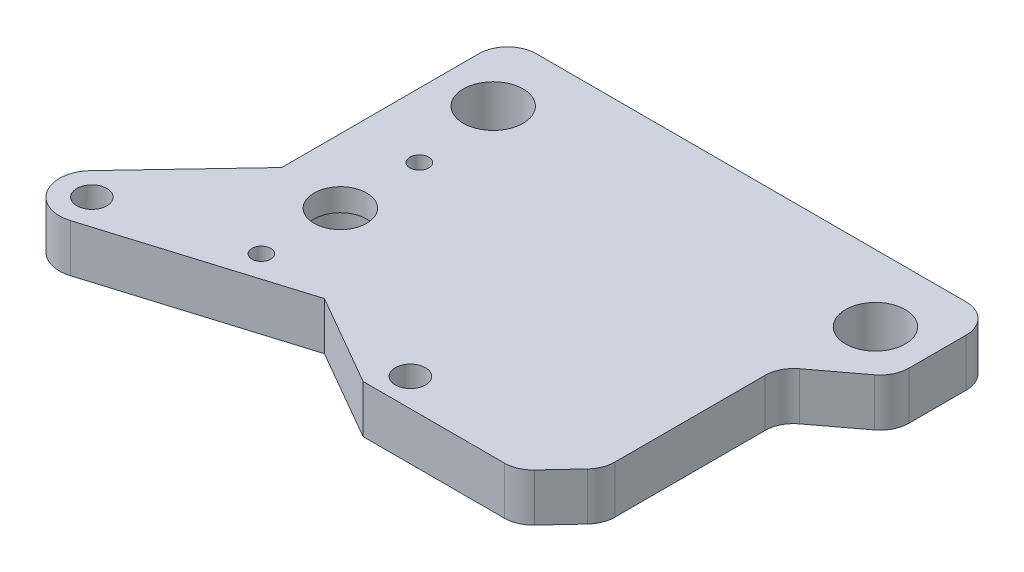
ISO-10303-21;
HEADER;
FILE_DESCRIPTION(('STEP AP214'),'2;1');
FILE_NAME('part.step','',(''),(''),'','','');
FILE_SCHEMA(('AUTOMOTIVE_DESIGN { 1 0 10303 214 1 1 1 1 }'));
ENDSEC;
DATA;
#1=APPLICATION_CONTEXT('core data for automotive mechanical design processes');
#2=APPLICATION_PROTOCOL_DEFINITION('international standard','automotive_design',2000,#1);
#3=PRODUCT_CONTEXT('',#1,'mechanical');
#4=PRODUCT('Part','Part','',(#3));
#5=PRODUCT_RELATED_PRODUCT_CATEGORY('part','',(#4));
#6=PRODUCT_DEFINITION_FORMATION('','',#4);
#7=PRODUCT_DEFINITION_CONTEXT('part definition',#1,'design');
#8=PRODUCT_DEFINITION('design','',#6,#7);
#9=PRODUCT_DEFINITION_SHAPE('','',#8);
#10=(LENGTH_UNIT() NAMED_UNIT(*) SI_UNIT(.MILLI.,.METRE.));
#11=(NAMED_UNIT(*) PLANE_ANGLE_UNIT() SI_UNIT($,.RADIAN.));
#12=(NAMED_UNIT(*) SI_UNIT($,.STERADIAN.) SOLID_ANGLE_UNIT());
#13=UNCERTAINTY_MEASURE_WITH_UNIT(LENGTH_MEASURE(1.E-05),#10,'distance_accuracy_value','');
#14=(GEOMETRIC_REPRESENTATION_CONTEXT(3) GLOBAL_UNCERTAINTY_ASSIGNED_CONTEXT((#13)) GLOBAL_UNIT_ASSIGNED_CONTEXT((#10,
#11,#12)) REPRESENTATION_CONTEXT('',''));
#15=CARTESIAN_POINT('',(0.,0.,0.));
#16=DIRECTION('',(0.,0.,1.));
#17=DIRECTION('',(1.,0.,0.));
#18=AXIS2_PLACEMENT_3D('',#15,#16,#17);
#19=CARTESIAN_POINT('',(0.,-6.35,0.));
#20=DIRECTION('',(0.,1.,0.));
#21=DIRECTION('',(0.,0.,1.));
#22=AXIS2_PLACEMENT_3D('',#19,#20,#21);
#23=CYLINDRICAL_SURFACE('',#22,5.);
#24=CARTESIAN_POINT('',(0.,-6.35,0.));
#25=DIRECTION('',(0.,1.,0.));
#26=DIRECTION('',(0.,0.,1.));
#27=AXIS2_PLACEMENT_3D('',#24,#25,#26);
#28=CIRCLE('',#27,5.);
#29=CARTESIAN_POINT('',(0.,-6.35,5.));
#30=VERTEX_POINT('',#29);
#31=EDGE_CURVE('E222',#30,#30,#28,.T.);
#32=ORIENTED_EDGE('',*,*,#31,.F.);
#33=EDGE_LOOP('',(#32));
#34=FACE_BOUND('',#33,.T.);
#35=CARTESIAN_POINT('',(0.,-3.,0.));
#36=DIRECTION('',(0.,1.,0.));
#37=DIRECTION('',(0.,0.,1.));
#38=AXIS2_PLACEMENT_3D('',#35,#36,#37);
#39=CIRCLE('',#38,5.);
#40=CARTESIAN_POINT('',(0.,-3.,5.));
#41=VERTEX_POINT('',#40);
#42=EDGE_CURVE('E11',#41,#41,#39,.F.);
#43=ORIENTED_EDGE('',*,*,#42,.F.);
#44=EDGE_LOOP('',(#43));
#45=FACE_BOUND('',#44,.T.);
#46=ADVANCED_FACE('F43',(#34,#45),#23,.F.);
#47=CARTESIAN_POINT('',(-17.78,-6.35,15.24));
#48=DIRECTION('',(0.,1.,0.));
#49=DIRECTION('',(0.,0.,1.));
#50=AXIS2_PLACEMENT_3D('',#47,#48,#49);
#51=CYLINDRICAL_SURFACE('',#50,4.318);
#52=CARTESIAN_POINT('',(-17.78,0.,15.24));
#53=DIRECTION('',(0.,1.,0.));
#54=DIRECTION('',(0.,0.,1.));
#55=AXIS2_PLACEMENT_3D('',#52,#53,#54);
#56=CIRCLE('',#55,4.318);
#57=CARTESIAN_POINT('',(-16.5178103251182,0.,19.3694068853313));
#58=VERTEX_POINT('',#57);
#59=CARTESIAN_POINT('',(-20.9174164667158,0.,12.2732270200805));
#60=VERTEX_POINT('',#59);
#61=EDGE_CURVE('E227',#58,#60,#56,.F.);
#62=ORIENTED_EDGE('',*,*,#61,.T.);
#63=DIRECTION('',(0.,1.,0.));
#64=VECTOR('',#63,1.);
#65=CARTESIAN_POINT('',(-20.9174164667158,-6.35,12.2732270200805));
#66=LINE('',#65,#64);
#67=CARTESIAN_POINT('',(-20.9174164667158,-6.35,12.2732270200805));
#68=VERTEX_POINT('',#67);
#69=EDGE_CURVE('E53',#68,#60,#66,.T.);
#70=ORIENTED_EDGE('',*,*,#69,.F.);
#71=CARTESIAN_POINT('',(-17.78,-6.35,15.24));
#72=DIRECTION('',(0.,1.,0.));
#73=DIRECTION('',(0.,0.,1.));
#74=AXIS2_PLACEMENT_3D('',#71,#72,#73);
#75=CIRCLE('',#74,4.318);
#76=CARTESIAN_POINT('',(-16.5178103251182,-6.35,19.3694068853313));
#77=VERTEX_POINT('',#76);
#78=EDGE_CURVE('E61',#77,#68,#75,.F.);
#79=ORIENTED_EDGE('',*,*,#78,.F.);
#80=DIRECTION('',(0.,1.,0.));
#81=VECTOR('',#80,1.);
#82=CARTESIAN_POINT('',(-16.5178103251182,-6.35,19.3694068853313));
#83=LINE('',#82,#81);
#84=EDGE_CURVE('E226',#77,#58,#83,.T.);
#85=ORIENTED_EDGE('',*,*,#84,.T.);
#86=EDGE_LOOP('',(#62,#70,#79,#85));
#87=FACE_BOUND('',#86,.T.);
#88=ADVANCED_FACE('F45',(#87),#51,.T.);
#89=CARTESIAN_POINT('',(-4.91597138022378,-6.35,-4.64859262888105));
#90=DIRECTION('',(-0.726590196089821,0.,-0.687071093080007));
#91=DIRECTION('',(-0.687071093080007,0.,0.726590196089821));
#92=AXIS2_PLACEMENT_3D('',#89,#90,#91);
#93=PLANE('',#92);
#94=DIRECTION('',(-0.687071093080007,0.,0.726590196089821));
#95=VECTOR('',#94,1.);
#96=CARTESIAN_POINT('',(-4.91597138022378,0.,-4.64859262888105));
#97=LINE('',#96,#95);
#98=CARTESIAN_POINT('',(-8.5725,0.,-0.781747008959347));
#99=VERTEX_POINT('',#98);
#100=EDGE_CURVE('E281',#99,#60,#97,.T.);
#101=ORIENTED_EDGE('',*,*,#100,.F.);
#102=DIRECTION('',(0.,1.,0.));
#103=VECTOR('',#102,1.);
#104=CARTESIAN_POINT('',(-8.5725,-6.35,-0.781747008959347));
#105=LINE('',#104,#103);
#106=CARTESIAN_POINT('',(-8.5725,-6.35,-0.781747008959347));
#107=VERTEX_POINT('',#106);
#108=EDGE_CURVE('E117',#107,#99,#105,.T.);
#109=ORIENTED_EDGE('',*,*,#108,.F.);
#110=DIRECTION('',(-0.687071093080007,0.,0.726590196089821));
#111=VECTOR('',#110,1.);
#112=CARTESIAN_POINT('',(-4.91597138022378,-6.35,-4.64859262888105));
#113=LINE('',#112,#111);
#114=EDGE_CURVE('E191',#107,#68,#113,.T.);
#115=ORIENTED_EDGE('',*,*,#114,.T.);
#116=ORIENTED_EDGE('',*,*,#69,.T.);
#117=EDGE_LOOP('',(#101,#109,#115,#116));
#118=FACE_BOUND('',#117,.T.);
#119=ADVANCED_FACE('F366',(#118),#93,.T.);
#120=CARTESIAN_POINT('',(-8.5725,-6.35,0.));
#121=DIRECTION('',(-1.,0.,0.));
#122=DIRECTION('',(0.,0.,1.));
#123=AXIS2_PLACEMENT_3D('',#120,#121,#122);
#124=PLANE('',#123);
#125=DIRECTION('',(0.,0.,1.));
#126=VECTOR('',#125,1.);
#127=CARTESIAN_POINT('',(-8.5725,0.,0.));
#128=LINE('',#127,#126);
#129=CARTESIAN_POINT('',(-8.5725,0.,-26.9875));
#130=VERTEX_POINT('',#129);
#131=EDGE_CURVE('E174',#130,#99,#128,.T.);
#132=ORIENTED_EDGE('',*,*,#131,.F.);
#133=DIRECTION('',(0.,1.,0.));
#134=VECTOR('',#133,1.);
#135=CARTESIAN_POINT('',(-8.5725,-6.35,-26.9875));
#136=LINE('',#135,#134);
#137=CARTESIAN_POINT('',(-8.5725,-6.35,-26.9875));
#138=VERTEX_POINT('',#137);
#139=EDGE_CURVE('E169',#138,#130,#136,.T.);
#140=ORIENTED_EDGE('',*,*,#139,.F.);
#141=DIRECTION('',(0.,0.,1.));
#142=VECTOR('',#141,1.);
#143=CARTESIAN_POINT('',(-8.5725,-6.35,0.));
#144=LINE('',#143,#142);
#145=EDGE_CURVE('E173',#138,#107,#144,.T.);
#146=ORIENTED_EDGE('',*,*,#145,.T.);
#147=ORIENTED_EDGE('',*,*,#108,.T.);
#148=EDGE_LOOP('',(#132,#140,#146,#147));
#149=FACE_BOUND('',#148,.T.);
#150=ADVANCED_FACE('F171',(#149),#124,.T.);
#151=CARTESIAN_POINT('',(-4.7625,-6.35,-26.9875));
#152=DIRECTION('',(0.,1.,0.));
#153=DIRECTION('',(0.,0.,1.));
#154=AXIS2_PLACEMENT_3D('',#151,#152,#153);
#155=CYLINDRICAL_SURFACE('',#154,3.81);
#156=CARTESIAN_POINT('',(-4.7625,0.,-26.9875));
#157=DIRECTION('',(0.,1.,0.));
#158=DIRECTION('',(0.,0.,1.));
#159=AXIS2_PLACEMENT_3D('',#156,#157,#158);
#160=CIRCLE('',#159,3.81);
#161=CARTESIAN_POINT('',(-4.7625,0.,-30.7975));
#162=VERTEX_POINT('',#161);
#163=EDGE_CURVE('E276',#130,#162,#160,.F.);
#164=ORIENTED_EDGE('',*,*,#163,.T.);
#165=DIRECTION('',(0.,1.,0.));
#166=VECTOR('',#165,1.);
#167=CARTESIAN_POINT('',(-4.7625,-6.35,-30.7975));
#168=LINE('',#167,#166);
#169=CARTESIAN_POINT('',(-4.7625,-6.35,-30.7975));
#170=VERTEX_POINT('',#169);
#171=EDGE_CURVE('E179',#170,#162,#168,.T.);
#172=ORIENTED_EDGE('',*,*,#171,.F.);
#173=CARTESIAN_POINT('',(-4.7625,-6.35,-26.9875));
#174=DIRECTION('',(0.,1.,0.));
#175=DIRECTION('',(0.,0.,1.));
#176=AXIS2_PLACEMENT_3D('',#173,#174,#175);
#177=CIRCLE('',#176,3.81);
#178=EDGE_CURVE('E182',#138,#170,#177,.F.);
#179=ORIENTED_EDGE('',*,*,#178,.F.);
#180=ORIENTED_EDGE('',*,*,#139,.T.);
#181=EDGE_LOOP('',(#164,#172,#179,#180));
#182=FACE_BOUND('',#181,.T.);
#183=ADVANCED_FACE('F183',(#182),#155,.T.);
#184=CARTESIAN_POINT('',(0.,-6.35,-30.7975));
#185=DIRECTION('',(0.,0.,-1.));
#186=DIRECTION('',(-1.,0.,0.));
#187=AXIS2_PLACEMENT_3D('',#184,#185,#186);
#188=PLANE('',#187);
#189=DIRECTION('',(-1.,0.,0.));
#190=VECTOR('',#189,1.);
#191=CARTESIAN_POINT('',(0.,0.,-30.7975));
#192=LINE('',#191,#190);
#193=CARTESIAN_POINT('',(52.3875,0.,-30.7975));
#194=VERTEX_POINT('',#193);
#195=EDGE_CURVE('E272',#194,#162,#192,.T.);
#196=ORIENTED_EDGE('',*,*,#195,.F.);
#197=DIRECTION('',(0.,1.,0.));
#198=VECTOR('',#197,1.);
#199=CARTESIAN_POINT('',(52.3875,-6.35,-30.7975));
#200=LINE('',#199,#198);
#201=CARTESIAN_POINT('',(52.3875,-6.35,-30.7975));
#202=VERTEX_POINT('',#201);
#203=EDGE_CURVE('E315',#202,#194,#200,.T.);
#204=ORIENTED_EDGE('',*,*,#203,.F.);
#205=DIRECTION('',(-1.,0.,0.));
#206=VECTOR('',#205,1.);
#207=CARTESIAN_POINT('',(0.,-6.35,-30.7975));
#208=LINE('',#207,#206);
#209=EDGE_CURVE('E187',#202,#170,#208,.T.);
#210=ORIENTED_EDGE('',*,*,#209,.T.);
#211=ORIENTED_EDGE('',*,*,#171,.T.);
#212=EDGE_LOOP('',(#196,#204,#210,#211));
#213=FACE_BOUND('',#212,.T.);
#214=ADVANCED_FACE('F480',(#213),#188,.T.);
#215=CARTESIAN_POINT('',(52.3875,-6.35,-26.9875));
#216=DIRECTION('',(0.,1.,0.));
#217=DIRECTION('',(0.,0.,1.));
#218=AXIS2_PLACEMENT_3D('',#215,#216,#217);
#219=CYLINDRICAL_SURFACE('',#218,3.81);
#220=CARTESIAN_POINT('',(52.3875,0.,-26.9875));
#221=DIRECTION('',(0.,1.,0.));
#222=DIRECTION('',(0.,0.,1.));
#223=AXIS2_PLACEMENT_3D('',#220,#221,#222);
#224=CIRCLE('',#223,3.81);
#225=CARTESIAN_POINT('',(56.1975,0.,-26.9875));
#226=VERTEX_POINT('',#225);
#227=EDGE_CURVE('E268',#194,#226,#224,.F.);
#228=ORIENTED_EDGE('',*,*,#227,.T.);
#229=DIRECTION('',(0.,1.,0.));
#230=VECTOR('',#229,1.);
#231=CARTESIAN_POINT('',(56.1975,-6.35,-26.9875));
#232=LINE('',#231,#230);
#233=CARTESIAN_POINT('',(56.1975,-6.35,-26.9875));
#234=VERTEX_POINT('',#233);
#235=EDGE_CURVE('E318',#234,#226,#232,.T.);
#236=ORIENTED_EDGE('',*,*,#235,.F.);
#237=CARTESIAN_POINT('',(52.3875,-6.35,-26.9875));
#238=DIRECTION('',(0.,1.,0.));
#239=DIRECTION('',(0.,0.,1.));
#240=AXIS2_PLACEMENT_3D('',#237,#238,#239);
#241=CIRCLE('',#240,3.81);
#242=EDGE_CURVE('E475',#202,#234,#241,.F.);
#243=ORIENTED_EDGE('',*,*,#242,.F.);
#244=ORIENTED_EDGE('',*,*,#203,.T.);
#245=EDGE_LOOP('',(#228,#236,#243,#244));
#246=FACE_BOUND('',#245,.T.);
#247=ADVANCED_FACE('F485',(#246),#219,.T.);
#248=CARTESIAN_POINT('',(56.1975,-6.35,1.02276151248003E-13));
#249=DIRECTION('',(1.,0.,0.));
#250=DIRECTION('',(0.,0.,-1.));
#251=AXIS2_PLACEMENT_3D('',#248,#249,#250);
#252=PLANE('',#251);
#253=DIRECTION('',(0.,0.,-1.));
#254=VECTOR('',#253,1.);
#255=CARTESIAN_POINT('',(56.1975,0.,1.02276151248003E-13));
#256=LINE('',#255,#254);
#257=CARTESIAN_POINT('',(56.1975,0.,-19.3620959266836));
#258=VERTEX_POINT('',#257);
#259=EDGE_CURVE('E264',#258,#226,#256,.T.);
#260=ORIENTED_EDGE('',*,*,#259,.F.);
#261=DIRECTION('',(0.,1.,0.));
#262=VECTOR('',#261,1.);
#263=CARTESIAN_POINT('',(56.1975,-6.35,-19.3620959266836));
#264=LINE('',#263,#262);
#265=CARTESIAN_POINT('',(56.1975,-6.35,-19.3620959266836));
#266=VERTEX_POINT('',#265);
#267=EDGE_CURVE('E321',#266,#258,#264,.T.);
#268=ORIENTED_EDGE('',*,*,#267,.F.);
#269=DIRECTION('',(0.,0.,-1.));
#270=VECTOR('',#269,1.);
#271=CARTESIAN_POINT('',(56.1975,-6.35,1.02276151248003E-13));
#272=LINE('',#271,#270);
#273=EDGE_CURVE('E471',#266,#234,#272,.T.);
#274=ORIENTED_EDGE('',*,*,#273,.T.);
#275=ORIENTED_EDGE('',*,*,#235,.T.);
#276=EDGE_LOOP('',(#260,#268,#274,#275));
#277=FACE_BOUND('',#276,.T.);
#278=ADVANCED_FACE('F489',(#277),#252,.T.);
#279=CARTESIAN_POINT('',(52.3875,-6.35,-19.3620959266836));
#280=DIRECTION('',(0.,1.,0.));
#281=DIRECTION('',(0.,0.,1.));
#282=AXIS2_PLACEMENT_3D('',#279,#280,#281);
#283=CYLINDRICAL_SURFACE('',#282,3.81);
#284=CARTESIAN_POINT('',(52.3875,0.,-19.3620959266836));
#285=DIRECTION('',(0.,1.,0.));
#286=DIRECTION('',(0.,0.,1.));
#287=AXIS2_PLACEMENT_3D('',#284,#285,#286);
#288=CIRCLE('',#287,3.81);
#289=CARTESIAN_POINT('',(54.6804152382093,0.,-16.3192946334034));
#290=VERTEX_POINT('',#289);
#291=EDGE_CURVE('E260',#258,#290,#288,.F.);
#292=ORIENTED_EDGE('',*,*,#291,.T.);
#293=DIRECTION('',(0.,1.,0.));
#294=VECTOR('',#293,1.);
#295=CARTESIAN_POINT('',(54.6804152382093,-6.35,-16.3192946334034));
#296=LINE('',#295,#294);
#297=CARTESIAN_POINT('',(54.6804152382093,-6.35,-16.3192946334034));
#298=VERTEX_POINT('',#297);
#299=EDGE_CURVE('E324',#298,#290,#296,.T.);
#300=ORIENTED_EDGE('',*,*,#299,.F.);
#301=CARTESIAN_POINT('',(52.3875,-6.35,-19.3620959266836));
#302=DIRECTION('',(0.,1.,0.));
#303=DIRECTION('',(0.,0.,1.));
#304=AXIS2_PLACEMENT_3D('',#301,#302,#303);
#305=CIRCLE('',#304,3.81);
#306=EDGE_CURVE('E468',#266,#298,#305,.F.);
#307=ORIENTED_EDGE('',*,*,#306,.F.);
#308=ORIENTED_EDGE('',*,*,#267,.T.);
#309=EDGE_LOOP('',(#292,#300,#307,#308));
#310=FACE_BOUND('',#309,.T.);
#311=ADVANCED_FACE('F494',(#310),#283,.T.);
#312=CARTESIAN_POINT('',(11.9606686655756,-6.35,15.8723434157696));
#313=DIRECTION('',(0.601815023152047,0.,0.798635510047294));
#314=DIRECTION('',(0.798635510047294,0.,-0.601815023152047));
#315=AXIS2_PLACEMENT_3D('',#312,#313,#314);
#316=PLANE('',#315);
#317=DIRECTION('',(0.798635510047294,0.,-0.601815023152047));
#318=VECTOR('',#317,1.);
#319=CARTESIAN_POINT('',(11.9606686655756,0.,15.8723434157696));
#320=LINE('',#319,#318);
#321=CARTESIAN_POINT('',(48.9855664772033,0.,-12.0279182848244));
#322=VERTEX_POINT('',#321);
#323=EDGE_CURVE('E256',#322,#290,#320,.T.);
#324=ORIENTED_EDGE('',*,*,#323,.F.);
#325=DIRECTION('',(0.,1.,0.));
#326=VECTOR('',#325,1.);
#327=CARTESIAN_POINT('',(48.9855664772033,-6.35,-12.0279182848244));
#328=LINE('',#327,#326);
#329=CARTESIAN_POINT('',(48.9855664772033,-6.35,-12.0279182848244));
#330=VERTEX_POINT('',#329);
#331=EDGE_CURVE('E327',#330,#322,#328,.T.);
#332=ORIENTED_EDGE('',*,*,#331,.F.);
#333=DIRECTION('',(0.798635510047294,0.,-0.601815023152047));
#334=VECTOR('',#333,1.);
#335=CARTESIAN_POINT('',(11.9606686655756,-6.35,15.8723434157696));
#336=LINE('',#335,#334);
#337=EDGE_CURVE('E464',#330,#298,#336,.T.);
#338=ORIENTED_EDGE('',*,*,#337,.T.);
#339=ORIENTED_EDGE('',*,*,#299,.T.);
#340=EDGE_LOOP('',(#324,#332,#338,#339));
#341=FACE_BOUND('',#340,.T.);
#342=ADVANCED_FACE('F530',(#341),#316,.T.);
#343=CARTESIAN_POINT('',(51.2784817154126,-6.35,-8.98511699154425));
#344=DIRECTION('',(0.,1.,0.));
#345=DIRECTION('',(0.,0.,1.));
#346=AXIS2_PLACEMENT_3D('',#343,#344,#345);
#347=CYLINDRICAL_SURFACE('',#346,3.80999999999999);
#348=CARTESIAN_POINT('',(51.2784817154126,0.,-8.98511699154425));
#349=DIRECTION('',(0.,1.,0.));
#350=DIRECTION('',(0.,0.,1.));
#351=AXIS2_PLACEMENT_3D('',#348,#349,#350);
#352=CIRCLE('',#351,3.80999999999999);
#353=CARTESIAN_POINT('',(47.4684817154126,0.,-8.98511699154425));
#354=VERTEX_POINT('',#353);
#355=EDGE_CURVE('E252',#354,#322,#352,.F.);
#356=ORIENTED_EDGE('',*,*,#355,.F.);
#357=DIRECTION('',(0.,1.,0.));
#358=VECTOR('',#357,1.);
#359=CARTESIAN_POINT('',(47.4684817154126,-6.35,-8.98511699154425));
#360=LINE('',#359,#358);
#361=CARTESIAN_POINT('',(47.4684817154126,-6.35,-8.98511699154425));
#362=VERTEX_POINT('',#361);
#363=EDGE_CURVE('E330',#362,#354,#360,.T.);
#364=ORIENTED_EDGE('',*,*,#363,.F.);
#365=CARTESIAN_POINT('',(51.2784817154126,-6.35,-8.98511699154425));
#366=DIRECTION('',(0.,1.,0.));
#367=DIRECTION('',(0.,0.,1.));
#368=AXIS2_PLACEMENT_3D('',#365,#366,#367);
#369=CIRCLE('',#368,3.80999999999999);
#370=EDGE_CURVE('E460',#362,#330,#369,.F.);
#371=ORIENTED_EDGE('',*,*,#370,.T.);
#372=ORIENTED_EDGE('',*,*,#331,.T.);
#373=EDGE_LOOP('',(#356,#364,#371,#372));
#374=FACE_BOUND('',#373,.T.);
#375=ADVANCED_FACE('F500',(#374),#347,.F.);
#376=CARTESIAN_POINT('',(47.4684817154126,-6.35,0.));
#377=DIRECTION('',(-1.,0.,0.));
#378=DIRECTION('',(0.,0.,1.));
#379=AXIS2_PLACEMENT_3D('',#376,#377,#378);
#380=PLANE('',#379);
#381=DIRECTION('',(0.,0.,1.));
#382=VECTOR('',#381,1.);
#383=CARTESIAN_POINT('',(47.4684817154126,0.,0.));
#384=LINE('',#383,#382);
#385=CARTESIAN_POINT('',(47.4684817154126,0.,10.9806107725939));
#386=VERTEX_POINT('',#385);
#387=EDGE_CURVE('E249',#354,#386,#384,.T.);
#388=ORIENTED_EDGE('',*,*,#387,.T.);
#389=DIRECTION('',(0.,1.,0.));
#390=VECTOR('',#389,1.);
#391=CARTESIAN_POINT('',(47.4684817154126,-6.35,10.9806107725939));
#392=LINE('',#391,#390);
#393=CARTESIAN_POINT('',(47.4684817154126,-6.35,10.9806107725939));
#394=VERTEX_POINT('',#393);
#395=EDGE_CURVE('E333',#394,#386,#392,.T.);
#396=ORIENTED_EDGE('',*,*,#395,.F.);
#397=DIRECTION('',(0.,0.,1.));
#398=VECTOR('',#397,1.);
#399=CARTESIAN_POINT('',(47.4684817154126,-6.35,0.));
#400=LINE('',#399,#398);
#401=EDGE_CURVE('E457',#362,#394,#400,.T.);
#402=ORIENTED_EDGE('',*,*,#401,.F.);
#403=ORIENTED_EDGE('',*,*,#363,.T.);
#404=EDGE_LOOP('',(#388,#396,#402,#403));
#405=FACE_BOUND('',#404,.T.);
#406=ADVANCED_FACE('F506',(#405),#380,.F.);
#407=CARTESIAN_POINT('',(43.6584817154126,-6.35,10.9806107725939));
#408=DIRECTION('',(0.,1.,0.));
#409=DIRECTION('',(0.,0.,1.));
#410=AXIS2_PLACEMENT_3D('',#407,#408,#409);
#411=CYLINDRICAL_SURFACE('',#410,3.81);
#412=CARTESIAN_POINT('',(43.6584817154126,0.,10.9806107725939));
#413=DIRECTION('',(0.,1.,0.));
#414=DIRECTION('',(0.,0.,1.));
#415=AXIS2_PLACEMENT_3D('',#412,#413,#414);
#416=CIRCLE('',#415,3.81);
#417=CARTESIAN_POINT('',(46.4449393185816,0.,13.579024524432));
#418=VERTEX_POINT('',#417);
#419=EDGE_CURVE('E246',#386,#418,#416,.F.);
#420=ORIENTED_EDGE('',*,*,#419,.T.);
#421=DIRECTION('',(0.,1.,0.));
#422=VECTOR('',#421,1.);
#423=CARTESIAN_POINT('',(46.4449393185816,-6.35,13.579024524432));
#424=LINE('',#423,#422);
#425=CARTESIAN_POINT('',(46.4449393185816,-6.35,13.579024524432));
#426=VERTEX_POINT('',#425);
#427=EDGE_CURVE('E337',#426,#418,#424,.T.);
#428=ORIENTED_EDGE('',*,*,#427,.F.);
#429=CARTESIAN_POINT('',(43.6584817154126,-6.35,10.9806107725939));
#430=DIRECTION('',(0.,1.,0.));
#431=DIRECTION('',(0.,0.,1.));
#432=AXIS2_PLACEMENT_3D('',#429,#430,#431);
#433=CIRCLE('',#432,3.81);
#434=EDGE_CURVE('E454',#394,#426,#433,.F.);
#435=ORIENTED_EDGE('',*,*,#434,.F.);
#436=ORIENTED_EDGE('',*,*,#395,.T.);
#437=EDGE_LOOP('',(#420,#428,#435,#436));
#438=FACE_BOUND('',#437,.T.);
#439=ADVANCED_FACE('F512',(#438),#411,.T.);
#440=CARTESIAN_POINT('',(31.6153606059378,-6.35,29.4818007187193));
#441=DIRECTION('',(-0.73135370161917,0.,-0.681998360062499));
#442=DIRECTION('',(-0.681998360062499,0.,0.73135370161917));
#443=AXIS2_PLACEMENT_3D('',#440,#441,#442);
#444=PLANE('',#443);
#445=DIRECTION('',(-0.681998360062499,0.,0.73135370161917));
#446=VECTOR('',#445,1.);
#447=CARTESIAN_POINT('',(31.6153606059378,0.,29.4818007187193));
#448=LINE('',#447,#446);
#449=CARTESIAN_POINT('',(43.0441600965525,0.,17.2259137518381));
#450=VERTEX_POINT('',#449);
#451=EDGE_CURVE('E243',#418,#450,#448,.T.);
#452=ORIENTED_EDGE('',*,*,#451,.T.);
#453=DIRECTION('',(0.,1.,0.));
#454=VECTOR('',#453,1.);
#455=CARTESIAN_POINT('',(43.0441600965525,-6.35,17.2259137518381));
#456=LINE('',#455,#454);
#457=CARTESIAN_POINT('',(43.0441600965525,-6.35,17.2259137518381));
#458=VERTEX_POINT('',#457);
#459=EDGE_CURVE('E341',#458,#450,#456,.T.);
#460=ORIENTED_EDGE('',*,*,#459,.F.);
#461=DIRECTION('',(-0.681998360062499,0.,0.73135370161917));
#462=VECTOR('',#461,1.);
#463=CARTESIAN_POINT('',(31.6153606059378,-6.35,29.4818007187193));
#464=LINE('',#463,#462);
#465=EDGE_CURVE('E451',#426,#458,#464,.T.);
#466=ORIENTED_EDGE('',*,*,#465,.F.);
#467=ORIENTED_EDGE('',*,*,#427,.T.);
#468=EDGE_LOOP('',(#452,#460,#466,#467));
#469=FACE_BOUND('',#468,.T.);
#470=ADVANCED_FACE('F516',(#469),#444,.F.);
#471=CARTESIAN_POINT('',(40.2577024933834,-6.35,14.6275));
#472=DIRECTION('',(0.,1.,0.));
#473=DIRECTION('',(0.,0.,1.));
#474=AXIS2_PLACEMENT_3D('',#471,#472,#473);
#475=CYLINDRICAL_SURFACE('',#474,3.81);
#476=CARTESIAN_POINT('',(40.2577024933834,0.,14.6275));
#477=DIRECTION('',(0.,1.,0.));
#478=DIRECTION('',(0.,0.,1.));
#479=AXIS2_PLACEMENT_3D('',#476,#477,#478);
#480=CIRCLE('',#479,3.81);
#481=CARTESIAN_POINT('',(40.2577024933834,0.,18.4375));
#482=VERTEX_POINT('',#481);
#483=EDGE_CURVE('E240',#450,#482,#480,.F.);
#484=ORIENTED_EDGE('',*,*,#483,.T.);
#485=DIRECTION('',(0.,1.,0.));
#486=VECTOR('',#485,1.);
#487=CARTESIAN_POINT('',(40.2577024933834,-6.35,18.4375));
#488=LINE('',#487,#486);
#489=CARTESIAN_POINT('',(40.2577024933834,-6.35,18.4375));
#490=VERTEX_POINT('',#489);
#491=EDGE_CURVE('E345',#490,#482,#488,.T.);
#492=ORIENTED_EDGE('',*,*,#491,.F.);
#493=CARTESIAN_POINT('',(40.2577024933834,-6.35,14.6275));
#494=DIRECTION('',(0.,1.,0.));
#495=DIRECTION('',(0.,0.,1.));
#496=AXIS2_PLACEMENT_3D('',#493,#494,#495);
#497=CIRCLE('',#496,3.81);
#498=EDGE_CURVE('E448',#458,#490,#497,.F.);
#499=ORIENTED_EDGE('',*,*,#498,.F.);
#500=ORIENTED_EDGE('',*,*,#459,.T.);
#501=EDGE_LOOP('',(#484,#492,#499,#500));
#502=FACE_BOUND('',#501,.T.);
#503=ADVANCED_FACE('F521',(#502),#475,.T.);
#504=CARTESIAN_POINT('',(0.,-6.35,18.4375));
#505=DIRECTION('',(0.,0.,-1.));
#506=DIRECTION('',(-1.,0.,0.));
#507=AXIS2_PLACEMENT_3D('',#504,#505,#506);
#508=PLANE('',#507);
#509=DIRECTION('',(-1.,0.,0.));
#510=VECTOR('',#509,1.);
#511=CARTESIAN_POINT('',(0.,0.,18.4375));
#512=LINE('',#511,#510);
#513=CARTESIAN_POINT('',(21.4659698195551,0.,18.4375));
#514=VERTEX_POINT('',#513);
#515=EDGE_CURVE('E237',#482,#514,#512,.T.);
#516=ORIENTED_EDGE('',*,*,#515,.T.);
#517=DIRECTION('',(0.,1.,0.));
#518=VECTOR('',#517,1.);
#519=CARTESIAN_POINT('',(21.4659698195551,-6.35,18.4375));
#520=LINE('',#519,#518);
#521=CARTESIAN_POINT('',(21.4659698195551,-6.35,18.4375));
#522=VERTEX_POINT('',#521);
#523=EDGE_CURVE('E349',#522,#514,#520,.T.);
#524=ORIENTED_EDGE('',*,*,#523,.F.);
#525=DIRECTION('',(-1.,0.,0.));
#526=VECTOR('',#525,1.);
#527=CARTESIAN_POINT('',(0.,-6.35,18.4375));
#528=LINE('',#527,#526);
#529=EDGE_CURVE('E445',#490,#522,#528,.T.);
#530=ORIENTED_EDGE('',*,*,#529,.F.);
#531=ORIENTED_EDGE('',*,*,#491,.T.);
#532=EDGE_LOOP('',(#516,#524,#530,#531));
#533=FACE_BOUND('',#532,.T.);
#534=ADVANCED_FACE('F527',(#533),#508,.F.);
#535=CARTESIAN_POINT('',(-2.63069175478496,-6.35,4.57176574770906));
#536=DIRECTION('',(0.498745579538251,0.,-0.866748433451745));
#537=DIRECTION('',(-0.866748433451745,0.,-0.498745579538251));
#538=AXIS2_PLACEMENT_3D('',#535,#536,#537);
#539=PLANE('',#538);
#540=DIRECTION('',(-0.866748433451745,0.,-0.498745579538251));
#541=VECTOR('',#540,1.);
#542=CARTESIAN_POINT('',(-2.63069175478496,0.,4.57176574770906));
#543=LINE('',#542,#541);
#544=CARTESIAN_POINT('',(9.34656141689971,0.,11.4637332942772));
#545=VERTEX_POINT('',#544);
#546=EDGE_CURVE('E234',#514,#545,#543,.T.);
#547=ORIENTED_EDGE('',*,*,#546,.T.);
#548=DIRECTION('',(0.,1.,0.));
#549=VECTOR('',#548,1.);
#550=CARTESIAN_POINT('',(9.34656141689971,-6.35,11.4637332942772));
#551=LINE('',#550,#549);
#552=CARTESIAN_POINT('',(9.34656141689971,-6.35,11.4637332942772));
#553=VERTEX_POINT('',#552);
#554=EDGE_CURVE('E353',#553,#545,#551,.T.);
#555=ORIENTED_EDGE('',*,*,#554,.F.);
#556=DIRECTION('',(-0.866748433451745,0.,-0.498745579538251));
#557=VECTOR('',#556,1.);
#558=CARTESIAN_POINT('',(-2.63069175478496,-6.35,4.57176574770906));
#559=LINE('',#558,#557);
#560=EDGE_CURVE('E442',#522,#553,#559,.T.);
#561=ORIENTED_EDGE('',*,*,#560,.F.);
#562=ORIENTED_EDGE('',*,*,#523,.T.);
#563=EDGE_LOOP('',(#547,#555,#561,#562));
#564=FACE_BOUND('',#563,.T.);
#565=ADVANCED_FACE('F389',(#564),#539,.F.);
#566=CARTESIAN_POINT('',(-1.5875,-6.35,-21.9075));
#567=DIRECTION('',(0.,1.,0.));
#568=DIRECTION('',(0.,0.,1.));
#569=AXIS2_PLACEMENT_3D('',#566,#567,#568);
#570=CYLINDRICAL_SURFACE('',#569,3.96875);
#571=CARTESIAN_POINT('',(-1.5875,-6.35,-21.9075));
#572=DIRECTION('',(0.,1.,0.));
#573=DIRECTION('',(0.,0.,1.));
#574=AXIS2_PLACEMENT_3D('',#571,#572,#573);
#575=CIRCLE('',#574,3.96875);
#576=CARTESIAN_POINT('',(-1.5875,-6.35,-17.93875));
#577=VERTEX_POINT('',#576);
#578=EDGE_CURVE('E218',#577,#577,#575,.T.);
#579=ORIENTED_EDGE('',*,*,#578,.F.);
#580=EDGE_LOOP('',(#579));
#581=FACE_BOUND('',#580,.T.);
#582=CARTESIAN_POINT('',(-1.5875,0.,-21.9075));
#583=DIRECTION('',(0.,1.,0.));
#584=DIRECTION('',(0.,0.,1.));
#585=AXIS2_PLACEMENT_3D('',#582,#583,#584);
#586=CIRCLE('',#585,3.96875);
#587=CARTESIAN_POINT('',(-1.5875,0.,-17.93875));
#588=VERTEX_POINT('',#587);
#589=EDGE_CURVE('E305',#588,#588,#586,.T.);
#590=ORIENTED_EDGE('',*,*,#589,.T.);
#591=EDGE_LOOP('',(#590));
#592=FACE_BOUND('',#591,.T.);
#593=ADVANCED_FACE('F385',(#581,#592),#570,.F.);
#594=CARTESIAN_POINT('',(49.2125,-6.35,-21.9075));
#595=DIRECTION('',(0.,1.,0.));
#596=DIRECTION('',(0.,0.,1.));
#597=AXIS2_PLACEMENT_3D('',#594,#595,#596);
#598=CYLINDRICAL_SURFACE('',#597,3.96874999999998);
#599=CARTESIAN_POINT('',(49.2125,-6.35,-21.9075));
#600=DIRECTION('',(0.,1.,0.));
#601=DIRECTION('',(0.,0.,1.));
#602=AXIS2_PLACEMENT_3D('',#599,#600,#601);
#603=CIRCLE('',#602,3.96874999999998);
#604=CARTESIAN_POINT('',(49.2125,-6.35,-17.93875));
#605=VERTEX_POINT('',#604);
#606=EDGE_CURVE('E214',#605,#605,#603,.T.);
#607=ORIENTED_EDGE('',*,*,#606,.F.);
#608=EDGE_LOOP('',(#607));
#609=FACE_BOUND('',#608,.T.);
#610=CARTESIAN_POINT('',(49.2125,0.,-21.9075));
#611=DIRECTION('',(0.,1.,0.));
#612=DIRECTION('',(0.,0.,1.));
#613=AXIS2_PLACEMENT_3D('',#610,#611,#612);
#614=CIRCLE('',#613,3.96874999999998);
#615=CARTESIAN_POINT('',(49.2125,0.,-17.93875));
#616=VERTEX_POINT('',#615);
#617=EDGE_CURVE('E301',#616,#616,#614,.T.);
#618=ORIENTED_EDGE('',*,*,#617,.T.);
#619=EDGE_LOOP('',(#618));
#620=FACE_BOUND('',#619,.T.);
#621=ADVANCED_FACE('F388',(#609,#620),#598,.F.);
#622=CARTESIAN_POINT('',(24.0125212267774,-6.35,14.7035990265501));
#623=DIRECTION('',(0.,1.,0.));
#624=DIRECTION('',(0.,0.,1.));
#625=AXIS2_PLACEMENT_3D('',#622,#623,#624);
#626=CYLINDRICAL_SURFACE('',#625,2.00000000000001);
#627=CARTESIAN_POINT('',(24.0125212267774,-6.35,14.7035990265501));
#628=DIRECTION('',(0.,1.,0.));
#629=DIRECTION('',(0.,0.,1.));
#630=AXIS2_PLACEMENT_3D('',#627,#628,#629);
#631=CIRCLE('',#630,2.00000000000001);
#632=CARTESIAN_POINT('',(24.0125212267774,-6.35,16.7035990265501));
#633=VERTEX_POINT('',#632);
#634=EDGE_CURVE('E210',#633,#633,#631,.T.);
#635=ORIENTED_EDGE('',*,*,#634,.F.);
#636=EDGE_LOOP('',(#635));
#637=FACE_BOUND('',#636,.T.);
#638=CARTESIAN_POINT('',(24.0125212267774,0.,14.7035990265501));
#639=DIRECTION('',(0.,1.,0.));
#640=DIRECTION('',(0.,0.,1.));
#641=AXIS2_PLACEMENT_3D('',#638,#639,#640);
#642=CIRCLE('',#641,2.00000000000001);
#643=CARTESIAN_POINT('',(24.0125212267774,0.,16.7035990265501));
#644=VERTEX_POINT('',#643);
#645=EDGE_CURVE('E297',#644,#644,#642,.T.);
#646=ORIENTED_EDGE('',*,*,#645,.T.);
#647=EDGE_LOOP('',(#646));
#648=FACE_BOUND('',#647,.T.);
#649=ADVANCED_FACE('F393',(#637,#648),#626,.F.);
#650=CARTESIAN_POINT('',(-17.78,-6.35,15.24));
#651=DIRECTION('',(0.,1.,0.));
#652=DIRECTION('',(0.,0.,1.));
#653=AXIS2_PLACEMENT_3D('',#650,#651,#652);
#654=CYLINDRICAL_SURFACE('',#653,2.);
#655=CARTESIAN_POINT('',(-17.78,-6.35,15.24));
#656=DIRECTION('',(0.,1.,0.));
#657=DIRECTION('',(0.,0.,1.));
#658=AXIS2_PLACEMENT_3D('',#655,#656,#657);
#659=CIRCLE('',#658,2.);
#660=CARTESIAN_POINT('',(-17.78,-6.35,17.24));
#661=VERTEX_POINT('',#660);
#662=EDGE_CURVE('E206',#661,#661,#659,.T.);
#663=ORIENTED_EDGE('',*,*,#662,.F.);
#664=EDGE_LOOP('',(#663));
#665=FACE_BOUND('',#664,.T.);
#666=CARTESIAN_POINT('',(-17.78,0.,15.24));
#667=DIRECTION('',(0.,1.,0.));
#668=DIRECTION('',(0.,0.,1.));
#669=AXIS2_PLACEMENT_3D('',#666,#667,#668);
#670=CIRCLE('',#669,2.);
#671=CARTESIAN_POINT('',(-17.78,0.,17.24));
#672=VERTEX_POINT('',#671);
#673=EDGE_CURVE('E293',#672,#672,#670,.T.);
#674=ORIENTED_EDGE('',*,*,#673,.T.);
#675=EDGE_LOOP('',(#674));
#676=FACE_BOUND('',#675,.T.);
#677=ADVANCED_FACE('F397',(#665,#676),#654,.F.);
#678=CARTESIAN_POINT('',(0.,-6.35,10.5));
#679=DIRECTION('',(0.,1.,0.));
#680=DIRECTION('',(0.,0.,1.));
#681=AXIS2_PLACEMENT_3D('',#678,#679,#680);
#682=CYLINDRICAL_SURFACE('',#681,1.25);
#683=CARTESIAN_POINT('',(0.,-6.35,10.5));
#684=DIRECTION('',(0.,1.,0.));
#685=DIRECTION('',(0.,0.,1.));
#686=AXIS2_PLACEMENT_3D('',#683,#684,#685);
#687=CIRCLE('',#686,1.25);
#688=CARTESIAN_POINT('',(0.,-6.35,11.75));
#689=VERTEX_POINT('',#688);
#690=EDGE_CURVE('E202',#689,#689,#687,.T.);
#691=ORIENTED_EDGE('',*,*,#690,.F.);
#692=EDGE_LOOP('',(#691));
#693=FACE_BOUND('',#692,.T.);
#694=CARTESIAN_POINT('',(0.,0.,10.5));
#695=DIRECTION('',(0.,1.,0.));
#696=DIRECTION('',(0.,0.,1.));
#697=AXIS2_PLACEMENT_3D('',#694,#695,#696);
#698=CIRCLE('',#697,1.25);
#699=CARTESIAN_POINT('',(0.,0.,11.75));
#700=VERTEX_POINT('',#699);
#701=EDGE_CURVE('E289',#700,#700,#698,.T.);
#702=ORIENTED_EDGE('',*,*,#701,.T.);
#703=EDGE_LOOP('',(#702));
#704=FACE_BOUND('',#703,.T.);
#705=ADVANCED_FACE('F401',(#693,#704),#682,.F.);
#706=CARTESIAN_POINT('',(0.,-6.35,-10.5));
#707=DIRECTION('',(0.,1.,0.));
#708=DIRECTION('',(0.,0.,1.));
#709=AXIS2_PLACEMENT_3D('',#706,#707,#708);
#710=CYLINDRICAL_SURFACE('',#709,1.25);
#711=CARTESIAN_POINT('',(0.,-6.35,-10.5));
#712=DIRECTION('',(0.,1.,0.));
#713=DIRECTION('',(0.,0.,1.));
#714=AXIS2_PLACEMENT_3D('',#711,#712,#713);
#715=CIRCLE('',#714,1.25);
#716=CARTESIAN_POINT('',(0.,-6.35,-9.25));
#717=VERTEX_POINT('',#716);
#718=EDGE_CURVE('E195',#717,#717,#715,.T.);
#719=ORIENTED_EDGE('',*,*,#718,.F.);
#720=EDGE_LOOP('',(#719));
#721=FACE_BOUND('',#720,.T.);
#722=CARTESIAN_POINT('',(0.,0.,-10.5));
#723=DIRECTION('',(0.,1.,0.));
#724=DIRECTION('',(0.,0.,1.));
#725=AXIS2_PLACEMENT_3D('',#722,#723,#724);
#726=CIRCLE('',#725,1.25);
#727=CARTESIAN_POINT('',(0.,0.,-9.25));
#728=VERTEX_POINT('',#727);
#729=EDGE_CURVE('E285',#728,#728,#726,.T.);
#730=ORIENTED_EDGE('',*,*,#729,.T.);
#731=EDGE_LOOP('',(#730));
#732=FACE_BOUND('',#731,.T.);
#733=ADVANCED_FACE('F404',(#721,#732),#710,.F.);
#734=CARTESIAN_POINT('',(4.00320661854568,-6.35,13.0969768672636));
#735=DIRECTION('',(-0.29230886403007,0.,-0.95632396603319));
#736=DIRECTION('',(-0.95632396603319,0.,0.29230886403007));
#737=AXIS2_PLACEMENT_3D('',#734,#735,#736);
#738=PLANE('',#737);
#739=DIRECTION('',(-0.95632396603319,0.,0.29230886403007));
#740=VECTOR('',#739,1.);
#741=CARTESIAN_POINT('',(4.00320661854568,0.,13.0969768672636));
#742=LINE('',#741,#740);
#743=EDGE_CURVE('E230',#545,#58,#742,.T.);
#744=ORIENTED_EDGE('',*,*,#743,.T.);
#745=ORIENTED_EDGE('',*,*,#84,.F.);
#746=DIRECTION('',(-0.95632396603319,0.,0.29230886403007));
#747=VECTOR('',#746,1.);
#748=CARTESIAN_POINT('',(4.00320661854568,-6.35,13.0969768672636));
#749=LINE('',#748,#747);
#750=EDGE_CURVE('E129',#553,#77,#749,.T.);
#751=ORIENTED_EDGE('',*,*,#750,.F.);
#752=ORIENTED_EDGE('',*,*,#554,.T.);
#753=EDGE_LOOP('',(#744,#745,#751,#752));
#754=FACE_BOUND('',#753,.T.);
#755=ADVANCED_FACE('F407',(#754),#738,.F.);
#756=CARTESIAN_POINT('',(0.,-6.35,0.));
#757=DIRECTION('',(0.,1.,0.));
#758=DIRECTION('',(0.,0.,1.));
#759=AXIS2_PLACEMENT_3D('',#756,#757,#758);
#760=PLANE('',#759);
#761=ORIENTED_EDGE('',*,*,#78,.T.);
#762=ORIENTED_EDGE('',*,*,#114,.F.);
#763=ORIENTED_EDGE('',*,*,#145,.F.);
#764=ORIENTED_EDGE('',*,*,#178,.T.);
#765=ORIENTED_EDGE('',*,*,#209,.F.);
#766=ORIENTED_EDGE('',*,*,#242,.T.);
#767=ORIENTED_EDGE('',*,*,#273,.F.);
#768=ORIENTED_EDGE('',*,*,#306,.T.);
#769=ORIENTED_EDGE('',*,*,#337,.F.);
#770=ORIENTED_EDGE('',*,*,#370,.F.);
#771=ORIENTED_EDGE('',*,*,#401,.T.);
#772=ORIENTED_EDGE('',*,*,#434,.T.);
#773=ORIENTED_EDGE('',*,*,#465,.T.);
#774=ORIENTED_EDGE('',*,*,#498,.T.);
#775=ORIENTED_EDGE('',*,*,#529,.T.);
#776=ORIENTED_EDGE('',*,*,#560,.T.);
#777=ORIENTED_EDGE('',*,*,#750,.T.);
#778=EDGE_LOOP('',(#761,#762,#763,#764,#765,#766,#767,#768,#769,#770,#771,#772,#773,#774,#775,
#776,#777));
#779=FACE_BOUND('',#778,.T.);
#780=ORIENTED_EDGE('',*,*,#718,.T.);
#781=EDGE_LOOP('',(#780));
#782=FACE_BOUND('',#781,.T.);
#783=ORIENTED_EDGE('',*,*,#690,.T.);
#784=EDGE_LOOP('',(#783));
#785=FACE_BOUND('',#784,.T.);
#786=ORIENTED_EDGE('',*,*,#662,.T.);
#787=EDGE_LOOP('',(#786));
#788=FACE_BOUND('',#787,.T.);
#789=ORIENTED_EDGE('',*,*,#634,.T.);
#790=EDGE_LOOP('',(#789));
#791=FACE_BOUND('',#790,.T.);
#792=ORIENTED_EDGE('',*,*,#606,.T.);
#793=EDGE_LOOP('',(#792));
#794=FACE_BOUND('',#793,.T.);
#795=ORIENTED_EDGE('',*,*,#578,.T.);
#796=EDGE_LOOP('',(#795));
#797=FACE_BOUND('',#796,.T.);
#798=ORIENTED_EDGE('',*,*,#31,.T.);
#799=EDGE_LOOP('',(#798));
#800=FACE_BOUND('',#799,.T.);
#801=ADVANCED_FACE('F189',(#779,#782,#785,#788,#791,#794,#797,#800),#760,.F.);
#802=CARTESIAN_POINT('',(0.,0.,0.));
#803=DIRECTION('',(0.,1.,0.));
#804=DIRECTION('',(0.,0.,1.));
#805=AXIS2_PLACEMENT_3D('',#802,#803,#804);
#806=PLANE('',#805);
#807=ORIENTED_EDGE('',*,*,#61,.F.);
#808=ORIENTED_EDGE('',*,*,#743,.F.);
#809=ORIENTED_EDGE('',*,*,#546,.F.);
#810=ORIENTED_EDGE('',*,*,#515,.F.);
#811=ORIENTED_EDGE('',*,*,#483,.F.);
#812=ORIENTED_EDGE('',*,*,#451,.F.);
#813=ORIENTED_EDGE('',*,*,#419,.F.);
#814=ORIENTED_EDGE('',*,*,#387,.F.);
#815=ORIENTED_EDGE('',*,*,#355,.T.);
#816=ORIENTED_EDGE('',*,*,#323,.T.);
#817=ORIENTED_EDGE('',*,*,#291,.F.);
#818=ORIENTED_EDGE('',*,*,#259,.T.);
#819=ORIENTED_EDGE('',*,*,#227,.F.);
#820=ORIENTED_EDGE('',*,*,#195,.T.);
#821=ORIENTED_EDGE('',*,*,#163,.F.);
#822=ORIENTED_EDGE('',*,*,#131,.T.);
#823=ORIENTED_EDGE('',*,*,#100,.T.);
#824=EDGE_LOOP('',(#807,#808,#809,#810,#811,#812,#813,#814,#815,#816,#817,#818,#819,#820,#821,
#822,#823));
#825=FACE_BOUND('',#824,.T.);
#826=ORIENTED_EDGE('',*,*,#729,.F.);
#827=EDGE_LOOP('',(#826));
#828=FACE_BOUND('',#827,.T.);
#829=ORIENTED_EDGE('',*,*,#701,.F.);
#830=EDGE_LOOP('',(#829));
#831=FACE_BOUND('',#830,.T.);
#832=ORIENTED_EDGE('',*,*,#673,.F.);
#833=EDGE_LOOP('',(#832));
#834=FACE_BOUND('',#833,.T.);
#835=ORIENTED_EDGE('',*,*,#645,.F.);
#836=EDGE_LOOP('',(#835));
#837=FACE_BOUND('',#836,.T.);
#838=ORIENTED_EDGE('',*,*,#617,.F.);
#839=EDGE_LOOP('',(#838));
#840=FACE_BOUND('',#839,.T.);
#841=ORIENTED_EDGE('',*,*,#589,.F.);
#842=EDGE_LOOP('',(#841));
#843=FACE_BOUND('',#842,.T.);
#844=CARTESIAN_POINT('',(0.,0.,0.));
#845=DIRECTION('',(0.,1.,0.));
#846=DIRECTION('',(0.,0.,1.));
#847=AXIS2_PLACEMENT_3D('',#844,#845,#846);
#848=CIRCLE('',#847,3.499999985);
#849=CARTESIAN_POINT('',(0.,0.,3.499999985));
#850=VERTEX_POINT('',#849);
#851=EDGE_CURVE('E430',#850,#850,#848,.T.);
#852=ORIENTED_EDGE('',*,*,#851,.F.);
#853=EDGE_LOOP('',(#852));
#854=FACE_BOUND('',#853,.T.);
#855=ADVANCED_FACE('F363',(#825,#828,#831,#834,#837,#840,#843,#854),#806,.T.);
#856=CARTESIAN_POINT('',(0.,-3.,0.));
#857=DIRECTION('',(0.,1.,0.));
#858=DIRECTION('',(0.,0.,1.));
#859=AXIS2_PLACEMENT_3D('',#856,#857,#858);
#860=PLANE('',#859);
#861=CARTESIAN_POINT('',(0.,-3.,0.));
#862=DIRECTION('',(0.,1.,0.));
#863=DIRECTION('',(0.,0.,1.));
#864=AXIS2_PLACEMENT_3D('',#861,#862,#863);
#865=CIRCLE('',#864,3.499999985);
#866=CARTESIAN_POINT('',(0.,-3.,3.499999985));
#867=VERTEX_POINT('',#866);
#868=EDGE_CURVE('E231',#867,#867,#865,.T.);
#869=ORIENTED_EDGE('',*,*,#868,.T.);
#870=EDGE_LOOP('',(#869));
#871=FACE_BOUND('',#870,.T.);
#872=ORIENTED_EDGE('',*,*,#42,.T.);
#873=EDGE_LOOP('',(#872));
#874=FACE_BOUND('',#873,.T.);
#875=ADVANCED_FACE('F417',(#871,#874),#860,.F.);
#876=CARTESIAN_POINT('',(0.,-3.,0.));
#877=DIRECTION('',(0.,1.,0.));
#878=DIRECTION('',(0.,0.,1.));
#879=AXIS2_PLACEMENT_3D('',#876,#877,#878);
#880=CYLINDRICAL_SURFACE('',#879,3.499999985);
#881=ORIENTED_EDGE('',*,*,#868,.F.);
#882=EDGE_LOOP('',(#881));
#883=FACE_BOUND('',#882,.T.);
#884=ORIENTED_EDGE('',*,*,#851,.T.);
#885=EDGE_LOOP('',(#884));
#886=FACE_BOUND('',#885,.T.);
#887=ADVANCED_FACE('F613',(#883,#886),#880,.F.);
#888=CLOSED_SHELL('',(#46,#88,#119,#150,#183,#214,#247,#278,#311,#342,#375,#406,#439,#470,#503,
#534,#565,#593,#621,#649,#677,#705,#733,#755,#801,#855,#875,#887));
#889=MANIFOLD_SOLID_BREP('B2',#888);
#890=ADVANCED_BREP_SHAPE_REPRESENTATION('',(#18,#889),#14);
#891=SHAPE_DEFINITION_REPRESENTATION(#9,#890);
ENDSEC;
END-ISO-10303-21;
